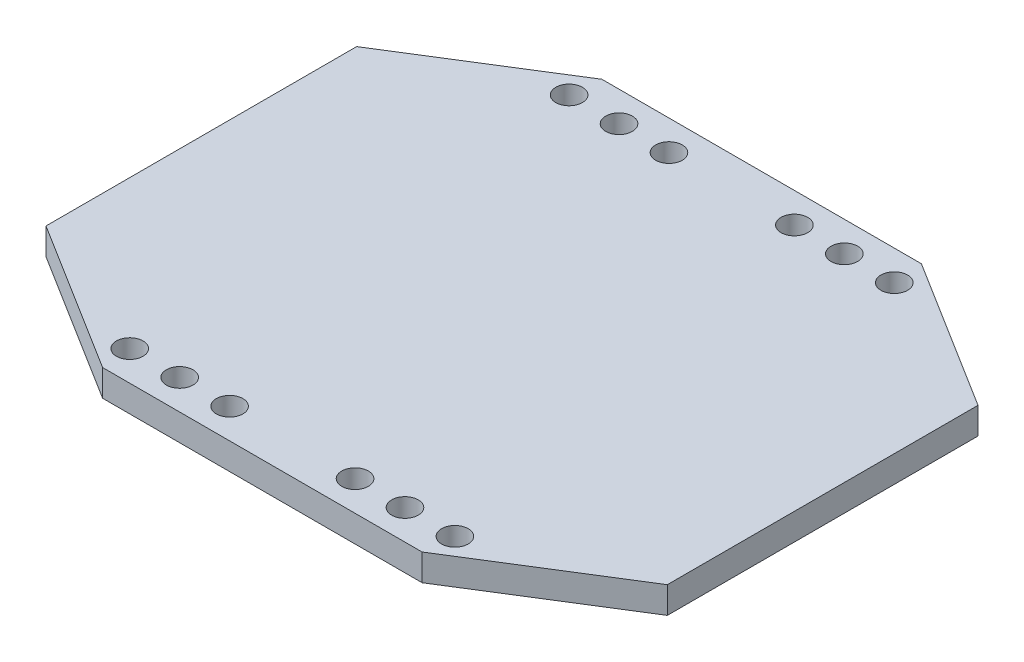
ISO-10303-21;
HEADER;
FILE_DESCRIPTION(('STEP AP214'),'2;1');
FILE_NAME('part.step','',(''),(''),'','','');
FILE_SCHEMA(('AUTOMOTIVE_DESIGN { 1 0 10303 214 1 1 1 1 }'));
ENDSEC;
DATA;
#1=APPLICATION_CONTEXT('core data for automotive mechanical design processes');
#2=APPLICATION_PROTOCOL_DEFINITION('international standard','automotive_design',2000,#1);
#3=PRODUCT_CONTEXT('',#1,'mechanical');
#4=PRODUCT('Part','Part','',(#3));
#5=PRODUCT_RELATED_PRODUCT_CATEGORY('part','',(#4));
#6=PRODUCT_DEFINITION_FORMATION('','',#4);
#7=PRODUCT_DEFINITION_CONTEXT('part definition',#1,'design');
#8=PRODUCT_DEFINITION('design','',#6,#7);
#9=PRODUCT_DEFINITION_SHAPE('','',#8);
#10=(LENGTH_UNIT() NAMED_UNIT(*) SI_UNIT(.MILLI.,.METRE.));
#11=(NAMED_UNIT(*) PLANE_ANGLE_UNIT() SI_UNIT($,.RADIAN.));
#12=(NAMED_UNIT(*) SI_UNIT($,.STERADIAN.) SOLID_ANGLE_UNIT());
#13=UNCERTAINTY_MEASURE_WITH_UNIT(LENGTH_MEASURE(1.E-05),#10,'distance_accuracy_value','');
#14=(GEOMETRIC_REPRESENTATION_CONTEXT(3) GLOBAL_UNCERTAINTY_ASSIGNED_CONTEXT((#13)) GLOBAL_UNIT_ASSIGNED_CONTEXT((#10,
#11,#12)) REPRESENTATION_CONTEXT('',''));
#15=CARTESIAN_POINT('',(0.,0.,0.));
#16=DIRECTION('',(0.,0.,1.));
#17=DIRECTION('',(1.,0.,0.));
#18=AXIS2_PLACEMENT_3D('',#15,#16,#17);
#19=CARTESIAN_POINT('',(-28.,1.2,14.));
#20=DIRECTION('',(0.529919264233209,0.,-0.848048096156424));
#21=DIRECTION('',(-0.848048096156424,0.,-0.529919264233209));
#22=AXIS2_PLACEMENT_3D('',#19,#20,#21);
#23=PLANE('',#22);
#24=DIRECTION('',(0.848048096156424,0.,0.529919264233209));
#25=VECTOR('',#24,1.);
#26=CARTESIAN_POINT('',(-28.,-1.2,14.));
#27=LINE('',#26,#25);
#28=CARTESIAN_POINT('',(-28.,-1.2,14.));
#29=VERTEX_POINT('',#28);
#30=CARTESIAN_POINT('',(-14.397156503151,-1.2,22.5000000000001));
#31=VERTEX_POINT('',#30);
#32=EDGE_CURVE('E128',#29,#31,#27,.T.);
#33=ORIENTED_EDGE('',*,*,#32,.T.);
#34=DIRECTION('',(0.,-1.,0.));
#35=VECTOR('',#34,1.);
#36=CARTESIAN_POINT('',(-14.397156503151,1.2,22.5000000000001));
#37=LINE('',#36,#35);
#38=CARTESIAN_POINT('',(-14.397156503151,1.2,22.5000000000001));
#39=VERTEX_POINT('',#38);
#40=EDGE_CURVE('E11',#39,#31,#37,.T.);
#41=ORIENTED_EDGE('',*,*,#40,.F.);
#42=DIRECTION('',(0.848048096156424,0.,0.529919264233209));
#43=VECTOR('',#42,1.);
#44=CARTESIAN_POINT('',(-28.,1.2,14.));
#45=LINE('',#44,#43);
#46=CARTESIAN_POINT('',(-28.,1.2,14.));
#47=VERTEX_POINT('',#46);
#48=EDGE_CURVE('E143',#47,#39,#45,.T.);
#49=ORIENTED_EDGE('',*,*,#48,.F.);
#50=DIRECTION('',(0.,-1.,0.));
#51=VECTOR('',#50,1.);
#52=CARTESIAN_POINT('',(-28.,1.2,14.));
#53=LINE('',#52,#51);
#54=EDGE_CURVE('E124',#47,#29,#53,.T.);
#55=ORIENTED_EDGE('',*,*,#54,.T.);
#56=EDGE_LOOP('',(#33,#41,#49,#55));
#57=FACE_BOUND('',#56,.T.);
#58=ADVANCED_FACE('F32',(#57),#23,.F.);
#59=CARTESIAN_POINT('',(-14.397156503151,1.2,22.5000000000001));
#60=DIRECTION('',(0.,0.,-1.));
#61=DIRECTION('',(-1.,0.,0.));
#62=AXIS2_PLACEMENT_3D('',#59,#60,#61);
#63=PLANE('',#62);
#64=DIRECTION('',(1.,0.,0.));
#65=VECTOR('',#64,1.);
#66=CARTESIAN_POINT('',(-14.397156503151,-1.2,22.5000000000001));
#67=LINE('',#66,#65);
#68=CARTESIAN_POINT('',(14.3971565031512,-1.2,22.5000000000001));
#69=VERTEX_POINT('',#68);
#70=EDGE_CURVE('E131',#31,#69,#67,.T.);
#71=ORIENTED_EDGE('',*,*,#70,.T.);
#72=DIRECTION('',(0.,-1.,0.));
#73=VECTOR('',#72,1.);
#74=CARTESIAN_POINT('',(14.3971565031512,1.2,22.5000000000001));
#75=LINE('',#74,#73);
#76=CARTESIAN_POINT('',(14.3971565031512,1.2,22.5000000000001));
#77=VERTEX_POINT('',#76);
#78=EDGE_CURVE('E40',#77,#69,#75,.T.);
#79=ORIENTED_EDGE('',*,*,#78,.F.);
#80=DIRECTION('',(1.,0.,0.));
#81=VECTOR('',#80,1.);
#82=CARTESIAN_POINT('',(-14.397156503151,1.2,22.5000000000001));
#83=LINE('',#82,#81);
#84=EDGE_CURVE('E91',#39,#77,#83,.T.);
#85=ORIENTED_EDGE('',*,*,#84,.F.);
#86=ORIENTED_EDGE('',*,*,#40,.T.);
#87=EDGE_LOOP('',(#71,#79,#85,#86));
#88=FACE_BOUND('',#87,.T.);
#89=ADVANCED_FACE('F299',(#88),#63,.F.);
#90=CARTESIAN_POINT('',(14.3971565031512,1.2,22.5000000000001));
#91=DIRECTION('',(-0.529919264233214,0.,-0.84804809615642));
#92=DIRECTION('',(-0.84804809615642,0.,0.529919264233214));
#93=AXIS2_PLACEMENT_3D('',#90,#91,#92);
#94=PLANE('',#93);
#95=DIRECTION('',(0.84804809615642,0.,-0.529919264233214));
#96=VECTOR('',#95,1.);
#97=CARTESIAN_POINT('',(14.3971565031512,-1.2,22.5000000000001));
#98=LINE('',#97,#96);
#99=CARTESIAN_POINT('',(28.,-1.2,14.));
#100=VERTEX_POINT('',#99);
#101=EDGE_CURVE('E134',#69,#100,#98,.T.);
#102=ORIENTED_EDGE('',*,*,#101,.T.);
#103=DIRECTION('',(0.,-1.,0.));
#104=VECTOR('',#103,1.);
#105=CARTESIAN_POINT('',(28.,1.2,14.));
#106=LINE('',#105,#104);
#107=CARTESIAN_POINT('',(28.,1.2,14.));
#108=VERTEX_POINT('',#107);
#109=EDGE_CURVE('E150',#108,#100,#106,.T.);
#110=ORIENTED_EDGE('',*,*,#109,.F.);
#111=DIRECTION('',(0.84804809615642,0.,-0.529919264233214));
#112=VECTOR('',#111,1.);
#113=CARTESIAN_POINT('',(14.3971565031512,1.2,22.5000000000001));
#114=LINE('',#113,#112);
#115=EDGE_CURVE('E158',#77,#108,#114,.T.);
#116=ORIENTED_EDGE('',*,*,#115,.F.);
#117=ORIENTED_EDGE('',*,*,#78,.T.);
#118=EDGE_LOOP('',(#102,#110,#116,#117));
#119=FACE_BOUND('',#118,.T.);
#120=ADVANCED_FACE('F156',(#119),#94,.F.);
#121=CARTESIAN_POINT('',(28.,1.2,-14.));
#122=DIRECTION('',(-1.,0.,0.));
#123=DIRECTION('',(0.,0.,1.));
#124=AXIS2_PLACEMENT_3D('',#121,#122,#123);
#125=PLANE('',#124);
#126=DIRECTION('',(0.,0.,-1.));
#127=VECTOR('',#126,1.);
#128=CARTESIAN_POINT('',(28.,-1.2,-14.));
#129=LINE('',#128,#127);
#130=CARTESIAN_POINT('',(28.,-1.2,-14.));
#131=VERTEX_POINT('',#130);
#132=EDGE_CURVE('E136',#100,#131,#129,.T.);
#133=ORIENTED_EDGE('',*,*,#132,.T.);
#134=DIRECTION('',(0.,-1.,0.));
#135=VECTOR('',#134,1.);
#136=CARTESIAN_POINT('',(28.,1.2,-14.));
#137=LINE('',#136,#135);
#138=CARTESIAN_POINT('',(28.,1.2,-14.));
#139=VERTEX_POINT('',#138);
#140=EDGE_CURVE('E147',#139,#131,#137,.T.);
#141=ORIENTED_EDGE('',*,*,#140,.F.);
#142=DIRECTION('',(0.,0.,-1.));
#143=VECTOR('',#142,1.);
#144=CARTESIAN_POINT('',(28.,1.2,-14.));
#145=LINE('',#144,#143);
#146=EDGE_CURVE('E170',#108,#139,#145,.T.);
#147=ORIENTED_EDGE('',*,*,#146,.F.);
#148=ORIENTED_EDGE('',*,*,#109,.T.);
#149=EDGE_LOOP('',(#133,#141,#147,#148));
#150=FACE_BOUND('',#149,.T.);
#151=ADVANCED_FACE('F166',(#150),#125,.F.);
#152=CARTESIAN_POINT('',(28.,1.2,-14.));
#153=DIRECTION('',(-0.529919264233209,0.,0.848048096156424));
#154=DIRECTION('',(0.848048096156424,0.,0.529919264233209));
#155=AXIS2_PLACEMENT_3D('',#152,#153,#154);
#156=PLANE('',#155);
#157=DIRECTION('',(-0.848048096156424,0.,-0.529919264233209));
#158=VECTOR('',#157,1.);
#159=CARTESIAN_POINT('',(28.,-1.2,-14.));
#160=LINE('',#159,#158);
#161=CARTESIAN_POINT('',(14.3971565031512,-1.2,-22.5));
#162=VERTEX_POINT('',#161);
#163=EDGE_CURVE('E138',#131,#162,#160,.T.);
#164=ORIENTED_EDGE('',*,*,#163,.T.);
#165=DIRECTION('',(0.,-1.,0.));
#166=VECTOR('',#165,1.);
#167=CARTESIAN_POINT('',(14.3971565031512,1.2,-22.5));
#168=LINE('',#167,#166);
#169=CARTESIAN_POINT('',(14.3971565031512,1.2,-22.5));
#170=VERTEX_POINT('',#169);
#171=EDGE_CURVE('E119',#170,#162,#168,.T.);
#172=ORIENTED_EDGE('',*,*,#171,.F.);
#173=DIRECTION('',(-0.848048096156424,0.,-0.529919264233209));
#174=VECTOR('',#173,1.);
#175=CARTESIAN_POINT('',(28.,1.2,-14.));
#176=LINE('',#175,#174);
#177=EDGE_CURVE('E110',#139,#170,#176,.T.);
#178=ORIENTED_EDGE('',*,*,#177,.F.);
#179=ORIENTED_EDGE('',*,*,#140,.T.);
#180=EDGE_LOOP('',(#164,#172,#178,#179));
#181=FACE_BOUND('',#180,.T.);
#182=ADVANCED_FACE('F169',(#181),#156,.F.);
#183=CARTESIAN_POINT('',(-14.397156503151,1.2,-22.5));
#184=DIRECTION('',(0.,0.,1.));
#185=DIRECTION('',(1.,0.,0.));
#186=AXIS2_PLACEMENT_3D('',#183,#184,#185);
#187=PLANE('',#186);
#188=DIRECTION('',(-1.,0.,0.));
#189=VECTOR('',#188,1.);
#190=CARTESIAN_POINT('',(-14.397156503151,-1.2,-22.5));
#191=LINE('',#190,#189);
#192=CARTESIAN_POINT('',(-14.397156503151,-1.2,-22.5));
#193=VERTEX_POINT('',#192);
#194=EDGE_CURVE('E118',#162,#193,#191,.T.);
#195=ORIENTED_EDGE('',*,*,#194,.T.);
#196=DIRECTION('',(0.,-1.,0.));
#197=VECTOR('',#196,1.);
#198=CARTESIAN_POINT('',(-14.397156503151,1.2,-22.5));
#199=LINE('',#198,#197);
#200=CARTESIAN_POINT('',(-14.397156503151,1.2,-22.5));
#201=VERTEX_POINT('',#200);
#202=EDGE_CURVE('E115',#201,#193,#199,.T.);
#203=ORIENTED_EDGE('',*,*,#202,.F.);
#204=DIRECTION('',(-1.,0.,0.));
#205=VECTOR('',#204,1.);
#206=CARTESIAN_POINT('',(-14.397156503151,1.2,-22.5));
#207=LINE('',#206,#205);
#208=EDGE_CURVE('E104',#170,#201,#207,.T.);
#209=ORIENTED_EDGE('',*,*,#208,.F.);
#210=ORIENTED_EDGE('',*,*,#171,.T.);
#211=EDGE_LOOP('',(#195,#203,#209,#210));
#212=FACE_BOUND('',#211,.T.);
#213=ADVANCED_FACE('F116',(#212),#187,.F.);
#214=CARTESIAN_POINT('',(-28.,1.2,-14.));
#215=DIRECTION('',(0.529919264233203,0.,0.848048096156427));
#216=DIRECTION('',(0.848048096156427,0.,-0.529919264233203));
#217=AXIS2_PLACEMENT_3D('',#214,#215,#216);
#218=PLANE('',#217);
#219=DIRECTION('',(-0.848048096156427,0.,0.529919264233203));
#220=VECTOR('',#219,1.);
#221=CARTESIAN_POINT('',(-28.,-1.2,-14.));
#222=LINE('',#221,#220);
#223=CARTESIAN_POINT('',(-28.,-1.2,-14.));
#224=VERTEX_POINT('',#223);
#225=EDGE_CURVE('E77',#193,#224,#222,.T.);
#226=ORIENTED_EDGE('',*,*,#225,.T.);
#227=DIRECTION('',(0.,-1.,0.));
#228=VECTOR('',#227,1.);
#229=CARTESIAN_POINT('',(-28.,1.2,-14.));
#230=LINE('',#229,#228);
#231=CARTESIAN_POINT('',(-28.,1.2,-14.));
#232=VERTEX_POINT('',#231);
#233=EDGE_CURVE('E120',#232,#224,#230,.T.);
#234=ORIENTED_EDGE('',*,*,#233,.F.);
#235=DIRECTION('',(-0.848048096156427,0.,0.529919264233203));
#236=VECTOR('',#235,1.);
#237=CARTESIAN_POINT('',(-28.,1.2,-14.));
#238=LINE('',#237,#236);
#239=EDGE_CURVE('E108',#201,#232,#238,.T.);
#240=ORIENTED_EDGE('',*,*,#239,.F.);
#241=ORIENTED_EDGE('',*,*,#202,.T.);
#242=EDGE_LOOP('',(#226,#234,#240,#241));
#243=FACE_BOUND('',#242,.T.);
#244=ADVANCED_FACE('F122',(#243),#218,.F.);
#245=CARTESIAN_POINT('',(-28.,1.2,14.));
#246=DIRECTION('',(1.,0.,0.));
#247=DIRECTION('',(0.,0.,-1.));
#248=AXIS2_PLACEMENT_3D('',#245,#246,#247);
#249=PLANE('',#248);
#250=DIRECTION('',(0.,0.,1.));
#251=VECTOR('',#250,1.);
#252=CARTESIAN_POINT('',(-28.,-1.2,14.));
#253=LINE('',#252,#251);
#254=EDGE_CURVE('E83',#224,#29,#253,.T.);
#255=ORIENTED_EDGE('',*,*,#254,.T.);
#256=ORIENTED_EDGE('',*,*,#54,.F.);
#257=DIRECTION('',(0.,0.,1.));
#258=VECTOR('',#257,1.);
#259=CARTESIAN_POINT('',(-28.,1.2,14.));
#260=LINE('',#259,#258);
#261=EDGE_CURVE('E48',#232,#47,#260,.T.);
#262=ORIENTED_EDGE('',*,*,#261,.F.);
#263=ORIENTED_EDGE('',*,*,#233,.T.);
#264=EDGE_LOOP('',(#255,#256,#262,#263));
#265=FACE_BOUND('',#264,.T.);
#266=ADVANCED_FACE('F259',(#265),#249,.F.);
#267=CARTESIAN_POINT('',(0.,1.2,0.));
#268=DIRECTION('',(0.,1.,0.));
#269=DIRECTION('',(0.,0.,1.));
#270=AXIS2_PLACEMENT_3D('',#267,#268,#269);
#271=PLANE('',#270);
#272=CARTESIAN_POINT('',(14.6532884434097,1.2,19.8));
#273=DIRECTION('',(0.,1.,0.));
#274=DIRECTION('',(0.,0.,-1.));
#275=AXIS2_PLACEMENT_3D('',#272,#273,#274);
#276=CIRCLE('',#275,1.2);
#277=CARTESIAN_POINT('',(14.6532884434097,1.2,18.6));
#278=VERTEX_POINT('',#277);
#279=EDGE_CURVE('E242',#278,#278,#276,.T.);
#280=ORIENTED_EDGE('',*,*,#279,.F.);
#281=EDGE_LOOP('',(#280));
#282=FACE_BOUND('',#281,.T.);
#283=CARTESIAN_POINT('',(10.1532884434097,1.2,19.8));
#284=DIRECTION('',(0.,1.,0.));
#285=DIRECTION('',(0.,0.,-1.));
#286=AXIS2_PLACEMENT_3D('',#283,#284,#285);
#287=CIRCLE('',#286,1.2);
#288=CARTESIAN_POINT('',(10.1532884434097,1.2,18.6));
#289=VERTEX_POINT('',#288);
#290=EDGE_CURVE('E236',#289,#289,#287,.T.);
#291=ORIENTED_EDGE('',*,*,#290,.F.);
#292=EDGE_LOOP('',(#291));
#293=FACE_BOUND('',#292,.T.);
#294=CARTESIAN_POINT('',(5.65328844340967,1.2,19.8));
#295=DIRECTION('',(0.,1.,0.));
#296=DIRECTION('',(0.,0.,-1.));
#297=AXIS2_PLACEMENT_3D('',#294,#295,#296);
#298=CIRCLE('',#297,1.2);
#299=CARTESIAN_POINT('',(5.65328844340967,1.2,18.6));
#300=VERTEX_POINT('',#299);
#301=EDGE_CURVE('E230',#300,#300,#298,.T.);
#302=ORIENTED_EDGE('',*,*,#301,.F.);
#303=EDGE_LOOP('',(#302));
#304=FACE_BOUND('',#303,.T.);
#305=CARTESIAN_POINT('',(-14.6532884434097,1.2,19.8));
#306=DIRECTION('',(0.,-1.,0.));
#307=DIRECTION('',(0.,0.,-1.));
#308=AXIS2_PLACEMENT_3D('',#305,#306,#307);
#309=CIRCLE('',#308,1.2);
#310=CARTESIAN_POINT('',(-14.6532884434097,1.2,18.6));
#311=VERTEX_POINT('',#310);
#312=EDGE_CURVE('E225',#311,#311,#309,.T.);
#313=ORIENTED_EDGE('',*,*,#312,.T.);
#314=EDGE_LOOP('',(#313));
#315=FACE_BOUND('',#314,.T.);
#316=CARTESIAN_POINT('',(-10.1532884434097,1.2,19.8));
#317=DIRECTION('',(0.,-1.,0.));
#318=DIRECTION('',(0.,0.,-1.));
#319=AXIS2_PLACEMENT_3D('',#316,#317,#318);
#320=CIRCLE('',#319,1.2);
#321=CARTESIAN_POINT('',(-10.1532884434097,1.2,18.6));
#322=VERTEX_POINT('',#321);
#323=EDGE_CURVE('E219',#322,#322,#320,.T.);
#324=ORIENTED_EDGE('',*,*,#323,.T.);
#325=EDGE_LOOP('',(#324));
#326=FACE_BOUND('',#325,.T.);
#327=CARTESIAN_POINT('',(-5.65328844340967,1.2,19.8));
#328=DIRECTION('',(0.,-1.,0.));
#329=DIRECTION('',(0.,0.,-1.));
#330=AXIS2_PLACEMENT_3D('',#327,#328,#329);
#331=CIRCLE('',#330,1.2);
#332=CARTESIAN_POINT('',(-5.65328844340967,1.2,18.6));
#333=VERTEX_POINT('',#332);
#334=EDGE_CURVE('E212',#333,#333,#331,.T.);
#335=ORIENTED_EDGE('',*,*,#334,.T.);
#336=EDGE_LOOP('',(#335));
#337=FACE_BOUND('',#336,.T.);
#338=CARTESIAN_POINT('',(14.6532884434097,1.2,-19.8));
#339=DIRECTION('',(0.,-1.,0.));
#340=DIRECTION('',(0.,0.,1.));
#341=AXIS2_PLACEMENT_3D('',#338,#339,#340);
#342=CIRCLE('',#341,1.2);
#343=CARTESIAN_POINT('',(14.6532884434097,1.2,-18.6));
#344=VERTEX_POINT('',#343);
#345=EDGE_CURVE('E207',#344,#344,#342,.T.);
#346=ORIENTED_EDGE('',*,*,#345,.T.);
#347=EDGE_LOOP('',(#346));
#348=FACE_BOUND('',#347,.T.);
#349=CARTESIAN_POINT('',(10.1532884434097,1.2,-19.8));
#350=DIRECTION('',(0.,-1.,0.));
#351=DIRECTION('',(0.,0.,1.));
#352=AXIS2_PLACEMENT_3D('',#349,#350,#351);
#353=CIRCLE('',#352,1.2);
#354=CARTESIAN_POINT('',(10.1532884434097,1.2,-18.6));
#355=VERTEX_POINT('',#354);
#356=EDGE_CURVE('E201',#355,#355,#353,.T.);
#357=ORIENTED_EDGE('',*,*,#356,.T.);
#358=EDGE_LOOP('',(#357));
#359=FACE_BOUND('',#358,.T.);
#360=CARTESIAN_POINT('',(5.65328844340967,1.2,-19.8));
#361=DIRECTION('',(0.,-1.,0.));
#362=DIRECTION('',(0.,0.,1.));
#363=AXIS2_PLACEMENT_3D('',#360,#361,#362);
#364=CIRCLE('',#363,1.2);
#365=CARTESIAN_POINT('',(5.65328844340967,1.2,-18.6));
#366=VERTEX_POINT('',#365);
#367=EDGE_CURVE('E194',#366,#366,#364,.T.);
#368=ORIENTED_EDGE('',*,*,#367,.T.);
#369=EDGE_LOOP('',(#368));
#370=FACE_BOUND('',#369,.T.);
#371=CARTESIAN_POINT('',(-14.6532884434097,1.2,-19.8));
#372=DIRECTION('',(0.,1.,0.));
#373=DIRECTION('',(0.,0.,1.));
#374=AXIS2_PLACEMENT_3D('',#371,#372,#373);
#375=CIRCLE('',#374,1.2);
#376=CARTESIAN_POINT('',(-14.6532884434097,1.2,-18.6));
#377=VERTEX_POINT('',#376);
#378=EDGE_CURVE('E189',#377,#377,#375,.T.);
#379=ORIENTED_EDGE('',*,*,#378,.F.);
#380=EDGE_LOOP('',(#379));
#381=FACE_BOUND('',#380,.T.);
#382=CARTESIAN_POINT('',(-10.1532884434097,1.2,-19.8));
#383=DIRECTION('',(0.,1.,0.));
#384=DIRECTION('',(0.,0.,1.));
#385=AXIS2_PLACEMENT_3D('',#382,#383,#384);
#386=CIRCLE('',#385,1.2);
#387=CARTESIAN_POINT('',(-10.1532884434097,1.2,-18.6));
#388=VERTEX_POINT('',#387);
#389=EDGE_CURVE('E183',#388,#388,#386,.T.);
#390=ORIENTED_EDGE('',*,*,#389,.F.);
#391=EDGE_LOOP('',(#390));
#392=FACE_BOUND('',#391,.T.);
#393=CARTESIAN_POINT('',(-5.65328844340967,1.2,-19.8));
#394=DIRECTION('',(0.,1.,0.));
#395=DIRECTION('',(0.,0.,1.));
#396=AXIS2_PLACEMENT_3D('',#393,#394,#395);
#397=CIRCLE('',#396,1.2);
#398=CARTESIAN_POINT('',(-5.65328844340967,1.2,-18.6));
#399=VERTEX_POINT('',#398);
#400=EDGE_CURVE('E176',#399,#399,#397,.T.);
#401=ORIENTED_EDGE('',*,*,#400,.F.);
#402=EDGE_LOOP('',(#401));
#403=FACE_BOUND('',#402,.T.);
#404=ORIENTED_EDGE('',*,*,#48,.T.);
#405=ORIENTED_EDGE('',*,*,#84,.T.);
#406=ORIENTED_EDGE('',*,*,#115,.T.);
#407=ORIENTED_EDGE('',*,*,#146,.T.);
#408=ORIENTED_EDGE('',*,*,#177,.T.);
#409=ORIENTED_EDGE('',*,*,#208,.T.);
#410=ORIENTED_EDGE('',*,*,#239,.T.);
#411=ORIENTED_EDGE('',*,*,#261,.T.);
#412=EDGE_LOOP('',(#404,#405,#406,#407,#408,#409,#410,#411));
#413=FACE_BOUND('',#412,.T.);
#414=ADVANCED_FACE('F106',(#282,#293,#304,#315,#326,#337,#348,#359,#370,#381,#392,#403,#413),
#271,.T.);
#415=CARTESIAN_POINT('',(0.,-1.2,0.));
#416=DIRECTION('',(0.,1.,0.));
#417=DIRECTION('',(0.,0.,1.));
#418=AXIS2_PLACEMENT_3D('',#415,#416,#417);
#419=PLANE('',#418);
#420=CARTESIAN_POINT('',(14.6532884434097,-1.2,19.8));
#421=DIRECTION('',(0.,1.,0.));
#422=DIRECTION('',(0.,0.,-1.));
#423=AXIS2_PLACEMENT_3D('',#420,#421,#422);
#424=CIRCLE('',#423,1.2);
#425=CARTESIAN_POINT('',(14.6532884434097,-1.2,18.6));
#426=VERTEX_POINT('',#425);
#427=EDGE_CURVE('E216',#426,#426,#424,.T.);
#428=ORIENTED_EDGE('',*,*,#427,.T.);
#429=EDGE_LOOP('',(#428));
#430=FACE_BOUND('',#429,.T.);
#431=CARTESIAN_POINT('',(10.1532884434097,-1.2,19.8));
#432=DIRECTION('',(0.,1.,0.));
#433=DIRECTION('',(0.,0.,-1.));
#434=AXIS2_PLACEMENT_3D('',#431,#432,#433);
#435=CIRCLE('',#434,1.2);
#436=CARTESIAN_POINT('',(10.1532884434097,-1.2,18.6));
#437=VERTEX_POINT('',#436);
#438=EDGE_CURVE('E239',#437,#437,#435,.T.);
#439=ORIENTED_EDGE('',*,*,#438,.T.);
#440=EDGE_LOOP('',(#439));
#441=FACE_BOUND('',#440,.T.);
#442=CARTESIAN_POINT('',(5.65328844340967,-1.2,19.8));
#443=DIRECTION('',(0.,1.,0.));
#444=DIRECTION('',(0.,0.,-1.));
#445=AXIS2_PLACEMENT_3D('',#442,#443,#444);
#446=CIRCLE('',#445,1.2);
#447=CARTESIAN_POINT('',(5.65328844340967,-1.2,18.6));
#448=VERTEX_POINT('',#447);
#449=EDGE_CURVE('E233',#448,#448,#446,.T.);
#450=ORIENTED_EDGE('',*,*,#449,.T.);
#451=EDGE_LOOP('',(#450));
#452=FACE_BOUND('',#451,.T.);
#453=CARTESIAN_POINT('',(-14.6532884434097,-1.2,19.8));
#454=DIRECTION('',(0.,-1.,0.));
#455=DIRECTION('',(0.,0.,-1.));
#456=AXIS2_PLACEMENT_3D('',#453,#454,#455);
#457=CIRCLE('',#456,1.2);
#458=CARTESIAN_POINT('',(-14.6532884434097,-1.2,18.6));
#459=VERTEX_POINT('',#458);
#460=EDGE_CURVE('E198',#459,#459,#457,.T.);
#461=ORIENTED_EDGE('',*,*,#460,.F.);
#462=EDGE_LOOP('',(#461));
#463=FACE_BOUND('',#462,.T.);
#464=CARTESIAN_POINT('',(-10.1532884434097,-1.2,19.8));
#465=DIRECTION('',(0.,-1.,0.));
#466=DIRECTION('',(0.,0.,-1.));
#467=AXIS2_PLACEMENT_3D('',#464,#465,#466);
#468=CIRCLE('',#467,1.2);
#469=CARTESIAN_POINT('',(-10.1532884434097,-1.2,18.6));
#470=VERTEX_POINT('',#469);
#471=EDGE_CURVE('E222',#470,#470,#468,.T.);
#472=ORIENTED_EDGE('',*,*,#471,.F.);
#473=EDGE_LOOP('',(#472));
#474=FACE_BOUND('',#473,.T.);
#475=CARTESIAN_POINT('',(-5.65328844340967,-1.2,19.8));
#476=DIRECTION('',(0.,-1.,0.));
#477=DIRECTION('',(0.,0.,-1.));
#478=AXIS2_PLACEMENT_3D('',#475,#476,#477);
#479=CIRCLE('',#478,1.2);
#480=CARTESIAN_POINT('',(-5.65328844340967,-1.2,18.6));
#481=VERTEX_POINT('',#480);
#482=EDGE_CURVE('E215',#481,#481,#479,.T.);
#483=ORIENTED_EDGE('',*,*,#482,.F.);
#484=EDGE_LOOP('',(#483));
#485=FACE_BOUND('',#484,.T.);
#486=CARTESIAN_POINT('',(14.6532884434097,-1.2,-19.8));
#487=DIRECTION('',(0.,-1.,0.));
#488=DIRECTION('',(0.,0.,1.));
#489=AXIS2_PLACEMENT_3D('',#486,#487,#488);
#490=CIRCLE('',#489,1.2);
#491=CARTESIAN_POINT('',(14.6532884434097,-1.2,-18.6));
#492=VERTEX_POINT('',#491);
#493=EDGE_CURVE('E180',#492,#492,#490,.T.);
#494=ORIENTED_EDGE('',*,*,#493,.F.);
#495=EDGE_LOOP('',(#494));
#496=FACE_BOUND('',#495,.T.);
#497=CARTESIAN_POINT('',(10.1532884434097,-1.2,-19.8));
#498=DIRECTION('',(0.,-1.,0.));
#499=DIRECTION('',(0.,0.,1.));
#500=AXIS2_PLACEMENT_3D('',#497,#498,#499);
#501=CIRCLE('',#500,1.2);
#502=CARTESIAN_POINT('',(10.1532884434097,-1.2,-18.6));
#503=VERTEX_POINT('',#502);
#504=EDGE_CURVE('E204',#503,#503,#501,.T.);
#505=ORIENTED_EDGE('',*,*,#504,.F.);
#506=EDGE_LOOP('',(#505));
#507=FACE_BOUND('',#506,.T.);
#508=CARTESIAN_POINT('',(5.65328844340967,-1.2,-19.8));
#509=DIRECTION('',(0.,-1.,0.));
#510=DIRECTION('',(0.,0.,1.));
#511=AXIS2_PLACEMENT_3D('',#508,#509,#510);
#512=CIRCLE('',#511,1.2);
#513=CARTESIAN_POINT('',(5.65328844340967,-1.2,-18.6));
#514=VERTEX_POINT('',#513);
#515=EDGE_CURVE('E197',#514,#514,#512,.T.);
#516=ORIENTED_EDGE('',*,*,#515,.F.);
#517=EDGE_LOOP('',(#516));
#518=FACE_BOUND('',#517,.T.);
#519=CARTESIAN_POINT('',(-14.6532884434097,-1.2,-19.8));
#520=DIRECTION('',(0.,1.,0.));
#521=DIRECTION('',(0.,0.,1.));
#522=AXIS2_PLACEMENT_3D('',#519,#520,#521);
#523=CIRCLE('',#522,1.2);
#524=CARTESIAN_POINT('',(-14.6532884434097,-1.2,-18.6));
#525=VERTEX_POINT('',#524);
#526=EDGE_CURVE('E132',#525,#525,#523,.T.);
#527=ORIENTED_EDGE('',*,*,#526,.T.);
#528=EDGE_LOOP('',(#527));
#529=FACE_BOUND('',#528,.T.);
#530=CARTESIAN_POINT('',(-10.1532884434097,-1.2,-19.8));
#531=DIRECTION('',(0.,1.,0.));
#532=DIRECTION('',(0.,0.,1.));
#533=AXIS2_PLACEMENT_3D('',#530,#531,#532);
#534=CIRCLE('',#533,1.2);
#535=CARTESIAN_POINT('',(-10.1532884434097,-1.2,-18.6));
#536=VERTEX_POINT('',#535);
#537=EDGE_CURVE('E186',#536,#536,#534,.T.);
#538=ORIENTED_EDGE('',*,*,#537,.T.);
#539=EDGE_LOOP('',(#538));
#540=FACE_BOUND('',#539,.T.);
#541=CARTESIAN_POINT('',(-5.65328844340967,-1.2,-19.8));
#542=DIRECTION('',(0.,1.,0.));
#543=DIRECTION('',(0.,0.,1.));
#544=AXIS2_PLACEMENT_3D('',#541,#542,#543);
#545=CIRCLE('',#544,1.2);
#546=CARTESIAN_POINT('',(-5.65328844340967,-1.2,-18.6));
#547=VERTEX_POINT('',#546);
#548=EDGE_CURVE('E179',#547,#547,#545,.T.);
#549=ORIENTED_EDGE('',*,*,#548,.T.);
#550=EDGE_LOOP('',(#549));
#551=FACE_BOUND('',#550,.T.);
#552=ORIENTED_EDGE('',*,*,#32,.F.);
#553=ORIENTED_EDGE('',*,*,#254,.F.);
#554=ORIENTED_EDGE('',*,*,#225,.F.);
#555=ORIENTED_EDGE('',*,*,#194,.F.);
#556=ORIENTED_EDGE('',*,*,#163,.F.);
#557=ORIENTED_EDGE('',*,*,#132,.F.);
#558=ORIENTED_EDGE('',*,*,#101,.F.);
#559=ORIENTED_EDGE('',*,*,#70,.F.);
#560=EDGE_LOOP('',(#552,#553,#554,#555,#556,#557,#558,#559));
#561=FACE_BOUND('',#560,.T.);
#562=ADVANCED_FACE('F162',(#430,#441,#452,#463,#474,#485,#496,#507,#518,#529,#540,#551,#561),
#419,.F.);
#563=CARTESIAN_POINT('',(-5.65328844340967,-1.2,-19.8));
#564=DIRECTION('',(0.,1.,0.));
#565=DIRECTION('',(0.,0.,1.));
#566=AXIS2_PLACEMENT_3D('',#563,#564,#565);
#567=CYLINDRICAL_SURFACE('',#566,1.2);
#568=ORIENTED_EDGE('',*,*,#548,.F.);
#569=EDGE_LOOP('',(#568));
#570=FACE_BOUND('',#569,.T.);
#571=ORIENTED_EDGE('',*,*,#400,.T.);
#572=EDGE_LOOP('',(#571));
#573=FACE_BOUND('',#572,.T.);
#574=ADVANCED_FACE('F283',(#570,#573),#567,.F.);
#575=CARTESIAN_POINT('',(-10.1532884434097,-1.2,-19.8));
#576=DIRECTION('',(0.,1.,0.));
#577=DIRECTION('',(0.,0.,1.));
#578=AXIS2_PLACEMENT_3D('',#575,#576,#577);
#579=CYLINDRICAL_SURFACE('',#578,1.2);
#580=ORIENTED_EDGE('',*,*,#537,.F.);
#581=EDGE_LOOP('',(#580));
#582=FACE_BOUND('',#581,.T.);
#583=ORIENTED_EDGE('',*,*,#389,.T.);
#584=EDGE_LOOP('',(#583));
#585=FACE_BOUND('',#584,.T.);
#586=ADVANCED_FACE('F285',(#582,#585),#579,.F.);
#587=CARTESIAN_POINT('',(-14.6532884434097,-1.2,-19.8));
#588=DIRECTION('',(0.,1.,0.));
#589=DIRECTION('',(0.,0.,1.));
#590=AXIS2_PLACEMENT_3D('',#587,#588,#589);
#591=CYLINDRICAL_SURFACE('',#590,1.2);
#592=ORIENTED_EDGE('',*,*,#526,.F.);
#593=EDGE_LOOP('',(#592));
#594=FACE_BOUND('',#593,.T.);
#595=ORIENTED_EDGE('',*,*,#378,.T.);
#596=EDGE_LOOP('',(#595));
#597=FACE_BOUND('',#596,.T.);
#598=ADVANCED_FACE('F292',(#594,#597),#591,.F.);
#599=CARTESIAN_POINT('',(5.65328844340967,-1.2,-19.8));
#600=DIRECTION('',(0.,1.,0.));
#601=DIRECTION('',(0.,0.,1.));
#602=AXIS2_PLACEMENT_3D('',#599,#600,#601);
#603=CYLINDRICAL_SURFACE('',#602,1.2);
#604=ORIENTED_EDGE('',*,*,#515,.T.);
#605=EDGE_LOOP('',(#604));
#606=FACE_BOUND('',#605,.T.);
#607=ORIENTED_EDGE('',*,*,#367,.F.);
#608=EDGE_LOOP('',(#607));
#609=FACE_BOUND('',#608,.T.);
#610=ADVANCED_FACE('F366',(#606,#609),#603,.F.);
#611=CARTESIAN_POINT('',(10.1532884434097,-1.2,-19.8));
#612=DIRECTION('',(0.,1.,0.));
#613=DIRECTION('',(0.,0.,1.));
#614=AXIS2_PLACEMENT_3D('',#611,#612,#613);
#615=CYLINDRICAL_SURFACE('',#614,1.2);
#616=ORIENTED_EDGE('',*,*,#504,.T.);
#617=EDGE_LOOP('',(#616));
#618=FACE_BOUND('',#617,.T.);
#619=ORIENTED_EDGE('',*,*,#356,.F.);
#620=EDGE_LOOP('',(#619));
#621=FACE_BOUND('',#620,.T.);
#622=ADVANCED_FACE('F376',(#618,#621),#615,.F.);
#623=CARTESIAN_POINT('',(14.6532884434097,-1.2,-19.8));
#624=DIRECTION('',(0.,1.,0.));
#625=DIRECTION('',(0.,0.,1.));
#626=AXIS2_PLACEMENT_3D('',#623,#624,#625);
#627=CYLINDRICAL_SURFACE('',#626,1.2);
#628=ORIENTED_EDGE('',*,*,#493,.T.);
#629=EDGE_LOOP('',(#628));
#630=FACE_BOUND('',#629,.T.);
#631=ORIENTED_EDGE('',*,*,#345,.F.);
#632=EDGE_LOOP('',(#631));
#633=FACE_BOUND('',#632,.T.);
#634=ADVANCED_FACE('F386',(#630,#633),#627,.F.);
#635=CARTESIAN_POINT('',(-5.65328844340967,-1.2,19.8));
#636=DIRECTION('',(0.,1.,0.));
#637=DIRECTION('',(0.,0.,1.));
#638=AXIS2_PLACEMENT_3D('',#635,#636,#637);
#639=CYLINDRICAL_SURFACE('',#638,1.2);
#640=ORIENTED_EDGE('',*,*,#482,.T.);
#641=EDGE_LOOP('',(#640));
#642=FACE_BOUND('',#641,.T.);
#643=ORIENTED_EDGE('',*,*,#334,.F.);
#644=EDGE_LOOP('',(#643));
#645=FACE_BOUND('',#644,.T.);
#646=ADVANCED_FACE('F395',(#642,#645),#639,.F.);
#647=CARTESIAN_POINT('',(-10.1532884434097,-1.2,19.8));
#648=DIRECTION('',(0.,1.,0.));
#649=DIRECTION('',(0.,0.,1.));
#650=AXIS2_PLACEMENT_3D('',#647,#648,#649);
#651=CYLINDRICAL_SURFACE('',#650,1.2);
#652=ORIENTED_EDGE('',*,*,#471,.T.);
#653=EDGE_LOOP('',(#652));
#654=FACE_BOUND('',#653,.T.);
#655=ORIENTED_EDGE('',*,*,#323,.F.);
#656=EDGE_LOOP('',(#655));
#657=FACE_BOUND('',#656,.T.);
#658=ADVANCED_FACE('F410',(#654,#657),#651,.F.);
#659=CARTESIAN_POINT('',(-14.6532884434097,-1.2,19.8));
#660=DIRECTION('',(0.,1.,0.));
#661=DIRECTION('',(0.,0.,1.));
#662=AXIS2_PLACEMENT_3D('',#659,#660,#661);
#663=CYLINDRICAL_SURFACE('',#662,1.2);
#664=ORIENTED_EDGE('',*,*,#460,.T.);
#665=EDGE_LOOP('',(#664));
#666=FACE_BOUND('',#665,.T.);
#667=ORIENTED_EDGE('',*,*,#312,.F.);
#668=EDGE_LOOP('',(#667));
#669=FACE_BOUND('',#668,.T.);
#670=ADVANCED_FACE('F420',(#666,#669),#663,.F.);
#671=CARTESIAN_POINT('',(5.65328844340967,-1.2,19.8));
#672=DIRECTION('',(0.,1.,0.));
#673=DIRECTION('',(0.,0.,1.));
#674=AXIS2_PLACEMENT_3D('',#671,#672,#673);
#675=CYLINDRICAL_SURFACE('',#674,1.2);
#676=ORIENTED_EDGE('',*,*,#449,.F.);
#677=EDGE_LOOP('',(#676));
#678=FACE_BOUND('',#677,.T.);
#679=ORIENTED_EDGE('',*,*,#301,.T.);
#680=EDGE_LOOP('',(#679));
#681=FACE_BOUND('',#680,.T.);
#682=ADVANCED_FACE('F430',(#678,#681),#675,.F.);
#683=CARTESIAN_POINT('',(10.1532884434097,-1.2,19.8));
#684=DIRECTION('',(0.,1.,0.));
#685=DIRECTION('',(0.,0.,1.));
#686=AXIS2_PLACEMENT_3D('',#683,#684,#685);
#687=CYLINDRICAL_SURFACE('',#686,1.2);
#688=ORIENTED_EDGE('',*,*,#438,.F.);
#689=EDGE_LOOP('',(#688));
#690=FACE_BOUND('',#689,.T.);
#691=ORIENTED_EDGE('',*,*,#290,.T.);
#692=EDGE_LOOP('',(#691));
#693=FACE_BOUND('',#692,.T.);
#694=ADVANCED_FACE('F253',(#690,#693),#687,.F.);
#695=CARTESIAN_POINT('',(14.6532884434097,-1.2,19.8));
#696=DIRECTION('',(0.,1.,0.));
#697=DIRECTION('',(0.,0.,1.));
#698=AXIS2_PLACEMENT_3D('',#695,#696,#697);
#699=CYLINDRICAL_SURFACE('',#698,1.2);
#700=ORIENTED_EDGE('',*,*,#427,.F.);
#701=EDGE_LOOP('',(#700));
#702=FACE_BOUND('',#701,.T.);
#703=ORIENTED_EDGE('',*,*,#279,.T.);
#704=EDGE_LOOP('',(#703));
#705=FACE_BOUND('',#704,.T.);
#706=ADVANCED_FACE('F250',(#702,#705),#699,.F.);
#707=CLOSED_SHELL('',(#58,#89,#120,#151,#182,#213,#244,#266,#414,#562,#574,#586,#598,#610,#622,
#634,#646,#658,#670,#682,#694,#706));
#708=MANIFOLD_SOLID_BREP('B2',#707);
#709=ADVANCED_BREP_SHAPE_REPRESENTATION('',(#18,#708),#14);
#710=SHAPE_DEFINITION_REPRESENTATION(#9,#709);
ENDSEC;
END-ISO-10303-21;
